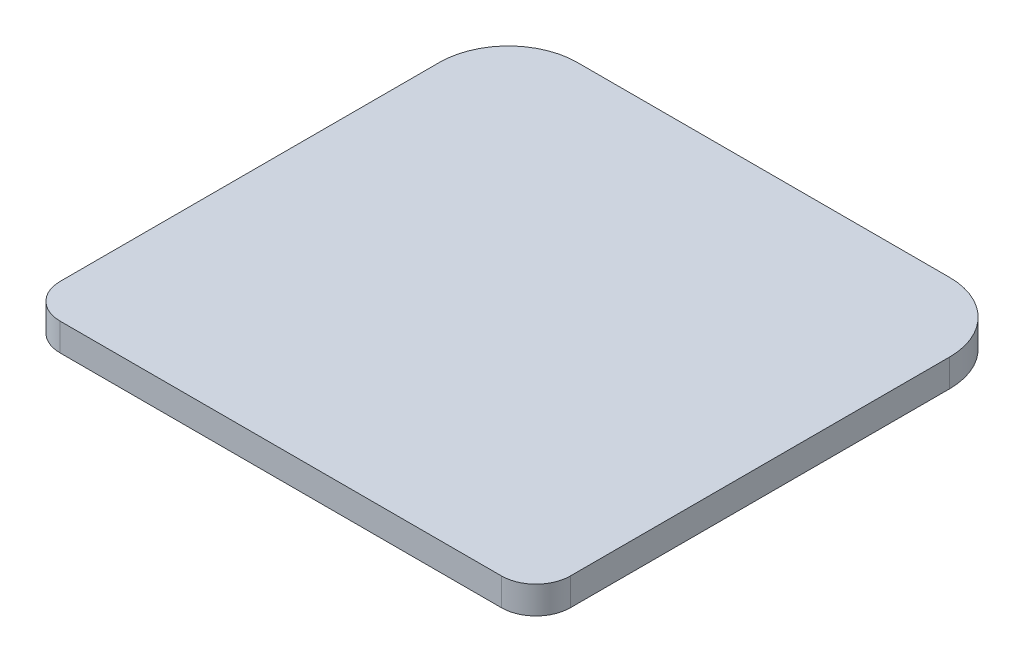
ISO-10303-21;
HEADER;
FILE_DESCRIPTION(('STEP AP214'),'2;1');
FILE_NAME('part.step','',(''),(''),'','','');
FILE_SCHEMA(('AUTOMOTIVE_DESIGN { 1 0 10303 214 1 1 1 1 }'));
ENDSEC;
DATA;
#1=APPLICATION_CONTEXT('core data for automotive mechanical design processes');
#2=APPLICATION_PROTOCOL_DEFINITION('international standard','automotive_design',2000,#1);
#3=PRODUCT_CONTEXT('',#1,'mechanical');
#4=PRODUCT('Part','Part','',(#3));
#5=PRODUCT_RELATED_PRODUCT_CATEGORY('part','',(#4));
#6=PRODUCT_DEFINITION_FORMATION('','',#4);
#7=PRODUCT_DEFINITION_CONTEXT('part definition',#1,'design');
#8=PRODUCT_DEFINITION('design','',#6,#7);
#9=PRODUCT_DEFINITION_SHAPE('','',#8);
#10=(LENGTH_UNIT() NAMED_UNIT(*) SI_UNIT(.MILLI.,.METRE.));
#11=(NAMED_UNIT(*) PLANE_ANGLE_UNIT() SI_UNIT($,.RADIAN.));
#12=(NAMED_UNIT(*) SI_UNIT($,.STERADIAN.) SOLID_ANGLE_UNIT());
#13=UNCERTAINTY_MEASURE_WITH_UNIT(LENGTH_MEASURE(1.E-05),#10,'distance_accuracy_value','');
#14=(GEOMETRIC_REPRESENTATION_CONTEXT(3) GLOBAL_UNCERTAINTY_ASSIGNED_CONTEXT((#13)) GLOBAL_UNIT_ASSIGNED_CONTEXT((#10,
#11,#12)) REPRESENTATION_CONTEXT('',''));
#15=CARTESIAN_POINT('',(0.,0.,0.));
#16=DIRECTION('',(0.,0.,1.));
#17=DIRECTION('',(1.,0.,0.));
#18=AXIS2_PLACEMENT_3D('',#15,#16,#17);
#19=CARTESIAN_POINT('',(7.4,0.8,7.));
#20=DIRECTION('',(-1.,0.,0.));
#21=DIRECTION('',(0.,0.,1.));
#22=AXIS2_PLACEMENT_3D('',#19,#20,#21);
#23=PLANE('',#22);
#24=DIRECTION('',(0.,0.,-1.));
#25=VECTOR('',#24,1.);
#26=CARTESIAN_POINT('',(7.4,0.8,7.));
#27=LINE('',#26,#25);
#28=CARTESIAN_POINT('',(7.4,0.8,6.));
#29=VERTEX_POINT('',#28);
#30=CARTESIAN_POINT('',(7.4,0.8,-5.));
#31=VERTEX_POINT('',#30);
#32=EDGE_CURVE('E142',#29,#31,#27,.T.);
#33=ORIENTED_EDGE('',*,*,#32,.F.);
#34=DIRECTION('',(0.,-1.,0.));
#35=VECTOR('',#34,1.);
#36=CARTESIAN_POINT('',(7.4,0.8,6.));
#37=LINE('',#36,#35);
#38=CARTESIAN_POINT('',(7.4,0.,6.));
#39=VERTEX_POINT('',#38);
#40=EDGE_CURVE('E11',#29,#39,#37,.T.);
#41=ORIENTED_EDGE('',*,*,#40,.T.);
#42=DIRECTION('',(0.,0.,-1.));
#43=VECTOR('',#42,1.);
#44=CARTESIAN_POINT('',(7.4,0.,7.));
#45=LINE('',#44,#43);
#46=CARTESIAN_POINT('',(7.4,0.,-5.));
#47=VERTEX_POINT('',#46);
#48=EDGE_CURVE('E144',#39,#47,#45,.T.);
#49=ORIENTED_EDGE('',*,*,#48,.T.);
#50=DIRECTION('',(0.,-1.,0.));
#51=VECTOR('',#50,1.);
#52=CARTESIAN_POINT('',(7.4,0.8,-5.));
#53=LINE('',#52,#51);
#54=EDGE_CURVE('E162',#47,#31,#53,.F.);
#55=ORIENTED_EDGE('',*,*,#54,.T.);
#56=EDGE_LOOP('',(#33,#41,#49,#55));
#57=FACE_BOUND('',#56,.T.);
#58=ADVANCED_FACE('F43',(#57),#23,.F.);
#59=CARTESIAN_POINT('',(-7.4,0.8,-7.));
#60=DIRECTION('',(0.,0.,1.));
#61=DIRECTION('',(1.,0.,0.));
#62=AXIS2_PLACEMENT_3D('',#59,#60,#61);
#63=PLANE('',#62);
#64=DIRECTION('',(-1.,0.,0.));
#65=VECTOR('',#64,1.);
#66=CARTESIAN_POINT('',(-7.4,0.,-7.));
#67=LINE('',#66,#65);
#68=CARTESIAN_POINT('',(5.4,0.,-7.));
#69=VERTEX_POINT('',#68);
#70=CARTESIAN_POINT('',(-5.4,0.,-7.));
#71=VERTEX_POINT('',#70);
#72=EDGE_CURVE('E137',#69,#71,#67,.T.);
#73=ORIENTED_EDGE('',*,*,#72,.T.);
#74=DIRECTION('',(0.,-1.,0.));
#75=VECTOR('',#74,1.);
#76=CARTESIAN_POINT('',(-5.4,0.8,-7.));
#77=LINE('',#76,#75);
#78=CARTESIAN_POINT('',(-5.4,0.8,-7.));
#79=VERTEX_POINT('',#78);
#80=EDGE_CURVE('E117',#71,#79,#77,.F.);
#81=ORIENTED_EDGE('',*,*,#80,.T.);
#82=DIRECTION('',(-1.,0.,0.));
#83=VECTOR('',#82,1.);
#84=CARTESIAN_POINT('',(-7.4,0.8,-7.));
#85=LINE('',#84,#83);
#86=CARTESIAN_POINT('',(5.4,0.8,-7.));
#87=VERTEX_POINT('',#86);
#88=EDGE_CURVE('E302',#87,#79,#85,.T.);
#89=ORIENTED_EDGE('',*,*,#88,.F.);
#90=DIRECTION('',(0.,-1.,0.));
#91=VECTOR('',#90,1.);
#92=CARTESIAN_POINT('',(5.4,0.8,-7.));
#93=LINE('',#92,#91);
#94=EDGE_CURVE('E123',#87,#69,#93,.T.);
#95=ORIENTED_EDGE('',*,*,#94,.T.);
#96=EDGE_LOOP('',(#73,#81,#89,#95));
#97=FACE_BOUND('',#96,.T.);
#98=ADVANCED_FACE('F203',(#97),#63,.F.);
#99=CARTESIAN_POINT('',(-7.4,0.8,7.));
#100=DIRECTION('',(1.,0.,0.));
#101=DIRECTION('',(0.,0.,-1.));
#102=AXIS2_PLACEMENT_3D('',#99,#100,#101);
#103=PLANE('',#102);
#104=DIRECTION('',(0.,0.,1.));
#105=VECTOR('',#104,1.);
#106=CARTESIAN_POINT('',(-7.4,0.,7.));
#107=LINE('',#106,#105);
#108=CARTESIAN_POINT('',(-7.4,0.,-5.));
#109=VERTEX_POINT('',#108);
#110=CARTESIAN_POINT('',(-7.4,0.,6.));
#111=VERTEX_POINT('',#110);
#112=EDGE_CURVE('E127',#109,#111,#107,.T.);
#113=ORIENTED_EDGE('',*,*,#112,.T.);
#114=DIRECTION('',(0.,-1.,0.));
#115=VECTOR('',#114,1.);
#116=CARTESIAN_POINT('',(-7.4,0.8,6.));
#117=LINE('',#116,#115);
#118=CARTESIAN_POINT('',(-7.4,0.8,6.));
#119=VERTEX_POINT('',#118);
#120=EDGE_CURVE('E67',#111,#119,#117,.F.);
#121=ORIENTED_EDGE('',*,*,#120,.T.);
#122=DIRECTION('',(0.,0.,1.));
#123=VECTOR('',#122,1.);
#124=CARTESIAN_POINT('',(-7.4,0.8,7.));
#125=LINE('',#124,#123);
#126=CARTESIAN_POINT('',(-7.4,0.8,-5.));
#127=VERTEX_POINT('',#126);
#128=EDGE_CURVE('E128',#127,#119,#125,.T.);
#129=ORIENTED_EDGE('',*,*,#128,.F.);
#130=DIRECTION('',(0.,-1.,0.));
#131=VECTOR('',#130,1.);
#132=CARTESIAN_POINT('',(-7.4,0.8,-5.));
#133=LINE('',#132,#131);
#134=EDGE_CURVE('E116',#127,#109,#133,.T.);
#135=ORIENTED_EDGE('',*,*,#134,.T.);
#136=EDGE_LOOP('',(#113,#121,#129,#135));
#137=FACE_BOUND('',#136,.T.);
#138=ADVANCED_FACE('F126',(#137),#103,.F.);
#139=CARTESIAN_POINT('',(-7.4,0.8,7.));
#140=DIRECTION('',(0.,0.,-1.));
#141=DIRECTION('',(-1.,0.,0.));
#142=AXIS2_PLACEMENT_3D('',#139,#140,#141);
#143=PLANE('',#142);
#144=DIRECTION('',(1.,0.,0.));
#145=VECTOR('',#144,1.);
#146=CARTESIAN_POINT('',(-7.4,0.8,7.));
#147=LINE('',#146,#145);
#148=CARTESIAN_POINT('',(-6.4,0.8,7.));
#149=VERTEX_POINT('',#148);
#150=CARTESIAN_POINT('',(6.4,0.8,7.));
#151=VERTEX_POINT('',#150);
#152=EDGE_CURVE('E130',#149,#151,#147,.T.);
#153=ORIENTED_EDGE('',*,*,#152,.F.);
#154=DIRECTION('',(0.,-1.,0.));
#155=VECTOR('',#154,1.);
#156=CARTESIAN_POINT('',(-6.4,0.8,7.));
#157=LINE('',#156,#155);
#158=CARTESIAN_POINT('',(-6.4,0.,7.));
#159=VERTEX_POINT('',#158);
#160=EDGE_CURVE('E169',#149,#159,#157,.T.);
#161=ORIENTED_EDGE('',*,*,#160,.T.);
#162=DIRECTION('',(1.,0.,0.));
#163=VECTOR('',#162,1.);
#164=CARTESIAN_POINT('',(-7.4,0.,7.));
#165=LINE('',#164,#163);
#166=CARTESIAN_POINT('',(6.4,0.,7.));
#167=VERTEX_POINT('',#166);
#168=EDGE_CURVE('E136',#159,#167,#165,.T.);
#169=ORIENTED_EDGE('',*,*,#168,.T.);
#170=DIRECTION('',(0.,-1.,0.));
#171=VECTOR('',#170,1.);
#172=CARTESIAN_POINT('',(6.4,0.8,7.));
#173=LINE('',#172,#171);
#174=EDGE_CURVE('E166',#167,#151,#173,.F.);
#175=ORIENTED_EDGE('',*,*,#174,.T.);
#176=EDGE_LOOP('',(#153,#161,#169,#175));
#177=FACE_BOUND('',#176,.T.);
#178=ADVANCED_FACE('F188',(#177),#143,.F.);
#179=CARTESIAN_POINT('',(0.,0.8,0.));
#180=DIRECTION('',(0.,-1.,0.));
#181=DIRECTION('',(0.,0.,-1.));
#182=AXIS2_PLACEMENT_3D('',#179,#180,#181);
#183=PLANE('',#182);
#184=ORIENTED_EDGE('',*,*,#128,.T.);
#185=CARTESIAN_POINT('',(-6.4,0.8,6.));
#186=DIRECTION('',(0.,-1.,0.));
#187=DIRECTION('',(0.,0.,-1.));
#188=AXIS2_PLACEMENT_3D('',#185,#186,#187);
#189=CIRCLE('',#188,1.);
#190=EDGE_CURVE('E52',#119,#149,#189,.F.);
#191=ORIENTED_EDGE('',*,*,#190,.T.);
#192=ORIENTED_EDGE('',*,*,#152,.T.);
#193=CARTESIAN_POINT('',(6.4,0.8,6.));
#194=DIRECTION('',(0.,-1.,0.));
#195=DIRECTION('',(0.,0.,-1.));
#196=AXIS2_PLACEMENT_3D('',#193,#194,#195);
#197=CIRCLE('',#196,1.);
#198=EDGE_CURVE('E59',#151,#29,#197,.F.);
#199=ORIENTED_EDGE('',*,*,#198,.T.);
#200=ORIENTED_EDGE('',*,*,#32,.T.);
#201=CARTESIAN_POINT('',(5.4,0.8,-5.));
#202=DIRECTION('',(0.,-1.,0.));
#203=DIRECTION('',(0.,0.,-1.));
#204=AXIS2_PLACEMENT_3D('',#201,#202,#203);
#205=CIRCLE('',#204,2.);
#206=EDGE_CURVE('E156',#31,#87,#205,.F.);
#207=ORIENTED_EDGE('',*,*,#206,.T.);
#208=ORIENTED_EDGE('',*,*,#88,.T.);
#209=CARTESIAN_POINT('',(-5.4,0.8,-5.));
#210=DIRECTION('',(0.,-1.,0.));
#211=DIRECTION('',(0.,0.,-1.));
#212=AXIS2_PLACEMENT_3D('',#209,#210,#211);
#213=CIRCLE('',#212,2.);
#214=EDGE_CURVE('E159',#79,#127,#213,.F.);
#215=ORIENTED_EDGE('',*,*,#214,.T.);
#216=EDGE_LOOP('',(#184,#191,#192,#199,#200,#207,#208,#215));
#217=FACE_BOUND('',#216,.T.);
#218=ADVANCED_FACE('F184',(#217),#183,.F.);
#219=CARTESIAN_POINT('',(0.,0.,0.));
#220=DIRECTION('',(0.,-1.,0.));
#221=DIRECTION('',(0.,0.,-1.));
#222=AXIS2_PLACEMENT_3D('',#219,#220,#221);
#223=PLANE('',#222);
#224=ORIENTED_EDGE('',*,*,#168,.F.);
#225=CARTESIAN_POINT('',(-6.4,0.,6.));
#226=DIRECTION('',(0.,-1.,0.));
#227=DIRECTION('',(0.,0.,-1.));
#228=AXIS2_PLACEMENT_3D('',#225,#226,#227);
#229=CIRCLE('',#228,1.);
#230=EDGE_CURVE('E134',#159,#111,#229,.T.);
#231=ORIENTED_EDGE('',*,*,#230,.T.);
#232=ORIENTED_EDGE('',*,*,#112,.F.);
#233=CARTESIAN_POINT('',(-5.4,0.,-5.));
#234=DIRECTION('',(0.,-1.,0.));
#235=DIRECTION('',(0.,0.,-1.));
#236=AXIS2_PLACEMENT_3D('',#233,#234,#235);
#237=CIRCLE('',#236,2.);
#238=EDGE_CURVE('E112',#109,#71,#237,.T.);
#239=ORIENTED_EDGE('',*,*,#238,.T.);
#240=ORIENTED_EDGE('',*,*,#72,.F.);
#241=CARTESIAN_POINT('',(5.4,0.,-5.));
#242=DIRECTION('',(0.,-1.,0.));
#243=DIRECTION('',(0.,0.,-1.));
#244=AXIS2_PLACEMENT_3D('',#241,#242,#243);
#245=CIRCLE('',#244,2.);
#246=EDGE_CURVE('E124',#69,#47,#245,.T.);
#247=ORIENTED_EDGE('',*,*,#246,.T.);
#248=ORIENTED_EDGE('',*,*,#48,.F.);
#249=CARTESIAN_POINT('',(6.4,0.,6.));
#250=DIRECTION('',(0.,-1.,0.));
#251=DIRECTION('',(0.,0.,-1.));
#252=AXIS2_PLACEMENT_3D('',#249,#250,#251);
#253=CIRCLE('',#252,1.);
#254=EDGE_CURVE('E173',#39,#167,#253,.T.);
#255=ORIENTED_EDGE('',*,*,#254,.T.);
#256=EDGE_LOOP('',(#224,#231,#232,#239,#240,#247,#248,#255));
#257=FACE_BOUND('',#256,.T.);
#258=ADVANCED_FACE('F133',(#257),#223,.T.);
#259=CARTESIAN_POINT('',(-5.4,0.8,-5.));
#260=DIRECTION('',(0.,-1.,0.));
#261=DIRECTION('',(0.,0.,-1.));
#262=AXIS2_PLACEMENT_3D('',#259,#260,#261);
#263=CYLINDRICAL_SURFACE('',#262,2.);
#264=ORIENTED_EDGE('',*,*,#214,.F.);
#265=ORIENTED_EDGE('',*,*,#80,.F.);
#266=ORIENTED_EDGE('',*,*,#238,.F.);
#267=ORIENTED_EDGE('',*,*,#134,.F.);
#268=EDGE_LOOP('',(#264,#265,#266,#267));
#269=FACE_BOUND('',#268,.T.);
#270=ADVANCED_FACE('F115',(#269),#263,.T.);
#271=CARTESIAN_POINT('',(5.4,0.8,-5.));
#272=DIRECTION('',(0.,-1.,0.));
#273=DIRECTION('',(0.,0.,-1.));
#274=AXIS2_PLACEMENT_3D('',#271,#272,#273);
#275=CYLINDRICAL_SURFACE('',#274,2.);
#276=ORIENTED_EDGE('',*,*,#206,.F.);
#277=ORIENTED_EDGE('',*,*,#54,.F.);
#278=ORIENTED_EDGE('',*,*,#246,.F.);
#279=ORIENTED_EDGE('',*,*,#94,.F.);
#280=EDGE_LOOP('',(#276,#277,#278,#279));
#281=FACE_BOUND('',#280,.T.);
#282=ADVANCED_FACE('F194',(#281),#275,.T.);
#283=CARTESIAN_POINT('',(-6.4,0.8,6.));
#284=DIRECTION('',(0.,-1.,0.));
#285=DIRECTION('',(0.,0.,-1.));
#286=AXIS2_PLACEMENT_3D('',#283,#284,#285);
#287=CYLINDRICAL_SURFACE('',#286,1.);
#288=ORIENTED_EDGE('',*,*,#190,.F.);
#289=ORIENTED_EDGE('',*,*,#120,.F.);
#290=ORIENTED_EDGE('',*,*,#230,.F.);
#291=ORIENTED_EDGE('',*,*,#160,.F.);
#292=EDGE_LOOP('',(#288,#289,#290,#291));
#293=FACE_BOUND('',#292,.T.);
#294=ADVANCED_FACE('F192',(#293),#287,.T.);
#295=CARTESIAN_POINT('',(6.4,0.8,6.));
#296=DIRECTION('',(0.,-1.,0.));
#297=DIRECTION('',(0.,0.,-1.));
#298=AXIS2_PLACEMENT_3D('',#295,#296,#297);
#299=CYLINDRICAL_SURFACE('',#298,1.);
#300=ORIENTED_EDGE('',*,*,#198,.F.);
#301=ORIENTED_EDGE('',*,*,#174,.F.);
#302=ORIENTED_EDGE('',*,*,#254,.F.);
#303=ORIENTED_EDGE('',*,*,#40,.F.);
#304=EDGE_LOOP('',(#300,#301,#302,#303));
#305=FACE_BOUND('',#304,.T.);
#306=ADVANCED_FACE('F45',(#305),#299,.T.);
#307=CLOSED_SHELL('',(#58,#98,#138,#178,#218,#258,#270,#282,#294,#306));
#308=MANIFOLD_SOLID_BREP('B2',#307);
#309=ADVANCED_BREP_SHAPE_REPRESENTATION('',(#18,#308),#14);
#310=SHAPE_DEFINITION_REPRESENTATION(#9,#309);
ENDSEC;
END-ISO-10303-21;
